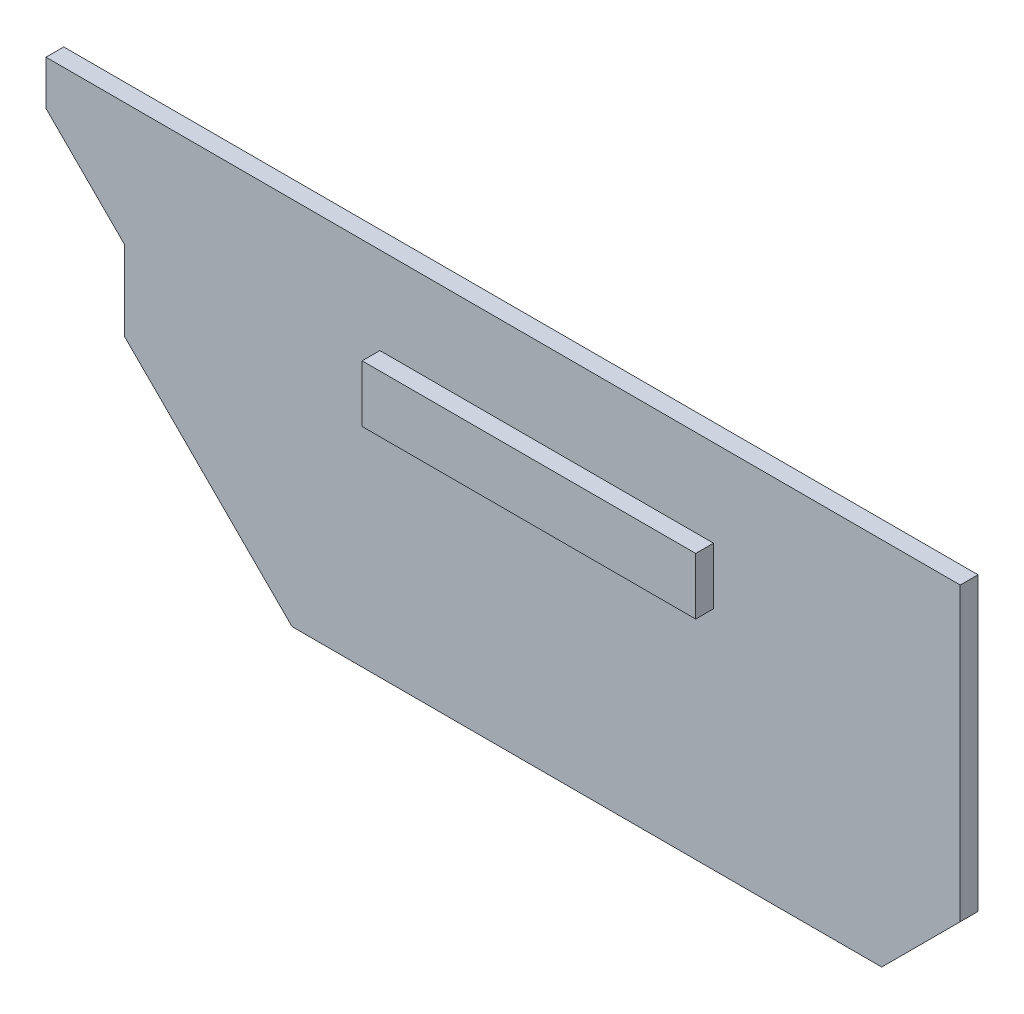
ISO-10303-21;
HEADER;
FILE_DESCRIPTION(('STEP AP214'),'2;1');
FILE_NAME('part.step','',(''),(''),'','','');
FILE_SCHEMA(('AUTOMOTIVE_DESIGN { 1 0 10303 214 1 1 1 1 }'));
ENDSEC;
DATA;
#1=APPLICATION_CONTEXT('core data for automotive mechanical design processes');
#2=APPLICATION_PROTOCOL_DEFINITION('international standard','automotive_design',2000,#1);
#3=PRODUCT_CONTEXT('',#1,'mechanical');
#4=PRODUCT('Part','Part','',(#3));
#5=PRODUCT_RELATED_PRODUCT_CATEGORY('part','',(#4));
#6=PRODUCT_DEFINITION_FORMATION('','',#4);
#7=PRODUCT_DEFINITION_CONTEXT('part definition',#1,'design');
#8=PRODUCT_DEFINITION('design','',#6,#7);
#9=PRODUCT_DEFINITION_SHAPE('','',#8);
#10=(LENGTH_UNIT() NAMED_UNIT(*) SI_UNIT(.MILLI.,.METRE.));
#11=(NAMED_UNIT(*) PLANE_ANGLE_UNIT() SI_UNIT($,.RADIAN.));
#12=(NAMED_UNIT(*) SI_UNIT($,.STERADIAN.) SOLID_ANGLE_UNIT());
#13=UNCERTAINTY_MEASURE_WITH_UNIT(LENGTH_MEASURE(1.E-05),#10,'distance_accuracy_value','');
#14=(GEOMETRIC_REPRESENTATION_CONTEXT(3) GLOBAL_UNCERTAINTY_ASSIGNED_CONTEXT((#13)) GLOBAL_UNIT_ASSIGNED_CONTEXT((#10,
#11,#12)) REPRESENTATION_CONTEXT('',''));
#15=CARTESIAN_POINT('',(0.,0.,0.));
#16=DIRECTION('',(0.,0.,1.));
#17=DIRECTION('',(1.,0.,0.));
#18=AXIS2_PLACEMENT_3D('',#15,#16,#17);
#19=CARTESIAN_POINT('',(0.,0.,2.4));
#20=DIRECTION('',(0.,0.,-1.));
#21=DIRECTION('',(-1.,0.,0.));
#22=AXIS2_PLACEMENT_3D('',#19,#20,#21);
#23=PLANE('',#22);
#24=DIRECTION('',(0.,-1.,0.));
#25=VECTOR('',#24,1.);
#26=CARTESIAN_POINT('',(0.,-6.,2.4));
#27=LINE('',#26,#25);
#28=CARTESIAN_POINT('',(0.,0.,2.4));
#29=VERTEX_POINT('',#28);
#30=CARTESIAN_POINT('',(0.,-6.,2.4));
#31=VERTEX_POINT('',#30);
#32=EDGE_CURVE('E164',#29,#31,#27,.T.);
#33=ORIENTED_EDGE('',*,*,#32,.T.);
#34=DIRECTION('',(0.707106781186549,-0.707106781186546,0.));
#35=VECTOR('',#34,1.);
#36=CARTESIAN_POINT('',(10.6066017177982,-16.6066017177982,2.4));
#37=LINE('',#36,#35);
#38=CARTESIAN_POINT('',(10.6066017177982,-16.6066017177982,2.4));
#39=VERTEX_POINT('',#38);
#40=EDGE_CURVE('E168',#31,#39,#37,.T.);
#41=ORIENTED_EDGE('',*,*,#40,.T.);
#42=DIRECTION('',(0.,-1.,0.));
#43=VECTOR('',#42,1.);
#44=CARTESIAN_POINT('',(10.6066017177982,-27.3725830020305,2.4));
#45=LINE('',#44,#43);
#46=CARTESIAN_POINT('',(10.6066017177982,-27.3725830020305,2.4));
#47=VERTEX_POINT('',#46);
#48=EDGE_CURVE('E172',#39,#47,#45,.T.);
#49=ORIENTED_EDGE('',*,*,#48,.T.);
#50=DIRECTION('',(0.707106781186549,-0.707106781186546,0.));
#51=VECTOR('',#50,1.);
#52=CARTESIAN_POINT('',(33.2340187157678,-50.,2.4));
#53=LINE('',#52,#51);
#54=CARTESIAN_POINT('',(33.2340187157678,-50.,2.4));
#55=VERTEX_POINT('',#54);
#56=EDGE_CURVE('E175',#47,#55,#53,.T.);
#57=ORIENTED_EDGE('',*,*,#56,.T.);
#58=DIRECTION('',(1.,0.,0.));
#59=VECTOR('',#58,1.);
#60=CARTESIAN_POINT('',(112.893398282202,-50.,2.4));
#61=LINE('',#60,#59);
#62=CARTESIAN_POINT('',(112.893398282202,-50.,2.4));
#63=VERTEX_POINT('',#62);
#64=EDGE_CURVE('E178',#55,#63,#61,.T.);
#65=ORIENTED_EDGE('',*,*,#64,.T.);
#66=DIRECTION('',(0.707106781186548,0.707106781186547,0.));
#67=VECTOR('',#66,1.);
#68=CARTESIAN_POINT('',(123.5,-39.3933982822018,2.4));
#69=LINE('',#68,#67);
#70=CARTESIAN_POINT('',(123.5,-39.3933982822018,2.4));
#71=VERTEX_POINT('',#70);
#72=EDGE_CURVE('E181',#63,#71,#69,.T.);
#73=ORIENTED_EDGE('',*,*,#72,.T.);
#74=DIRECTION('',(0.,1.,0.));
#75=VECTOR('',#74,1.);
#76=CARTESIAN_POINT('',(123.5,0.,2.4));
#77=LINE('',#76,#75);
#78=CARTESIAN_POINT('',(123.5,0.,2.4));
#79=VERTEX_POINT('',#78);
#80=EDGE_CURVE('E184',#71,#79,#77,.T.);
#81=ORIENTED_EDGE('',*,*,#80,.T.);
#82=DIRECTION('',(-1.,0.,0.));
#83=VECTOR('',#82,1.);
#84=CARTESIAN_POINT('',(0.,0.,2.4));
#85=LINE('',#84,#83);
#86=EDGE_CURVE('E187',#79,#29,#85,.T.);
#87=ORIENTED_EDGE('',*,*,#86,.T.);
#88=EDGE_LOOP('',(#33,#41,#49,#57,#65,#73,#81,#87));
#89=FACE_BOUND('',#88,.T.);
#90=DIRECTION('',(0.,-1.,0.));
#91=VECTOR('',#90,1.);
#92=CARTESIAN_POINT('',(45.1066017177982,-11.77,2.4));
#93=LINE('',#92,#91);
#94=CARTESIAN_POINT('',(45.1066017177982,-11.77,2.4));
#95=VERTEX_POINT('',#94);
#96=CARTESIAN_POINT('',(45.1066017177982,-19.45,2.4));
#97=VERTEX_POINT('',#96);
#98=EDGE_CURVE('E151',#95,#97,#93,.T.);
#99=ORIENTED_EDGE('',*,*,#98,.F.);
#100=DIRECTION('',(-1.,0.,0.));
#101=VECTOR('',#100,1.);
#102=CARTESIAN_POINT('',(45.1066017177982,-11.77,2.4));
#103=LINE('',#102,#101);
#104=CARTESIAN_POINT('',(90.1666017177982,-11.77,2.4));
#105=VERTEX_POINT('',#104);
#106=EDGE_CURVE('E148',#105,#95,#103,.T.);
#107=ORIENTED_EDGE('',*,*,#106,.F.);
#108=DIRECTION('',(0.,1.,0.));
#109=VECTOR('',#108,1.);
#110=CARTESIAN_POINT('',(90.1666017177982,-11.77,2.4));
#111=LINE('',#110,#109);
#112=CARTESIAN_POINT('',(90.1666017177982,-19.45,2.4));
#113=VERTEX_POINT('',#112);
#114=EDGE_CURVE('E60',#113,#105,#111,.T.);
#115=ORIENTED_EDGE('',*,*,#114,.F.);
#116=DIRECTION('',(1.,0.,0.));
#117=VECTOR('',#116,1.);
#118=CARTESIAN_POINT('',(45.1066017177982,-19.45,2.4));
#119=LINE('',#118,#117);
#120=EDGE_CURVE('E55',#97,#113,#119,.T.);
#121=ORIENTED_EDGE('',*,*,#120,.F.);
#122=EDGE_LOOP('',(#99,#107,#115,#121));
#123=FACE_BOUND('',#122,.T.);
#124=ADVANCED_FACE('F39',(#89,#123),#23,.F.);
#125=CARTESIAN_POINT('',(0.,-6.,2.4));
#126=DIRECTION('',(1.,0.,0.));
#127=DIRECTION('',(0.,0.,-1.));
#128=AXIS2_PLACEMENT_3D('',#125,#126,#127);
#129=PLANE('',#128);
#130=DIRECTION('',(0.,-1.,0.));
#131=VECTOR('',#130,1.);
#132=CARTESIAN_POINT('',(0.,-6.,0.));
#133=LINE('',#132,#131);
#134=CARTESIAN_POINT('',(0.,0.,0.));
#135=VERTEX_POINT('',#134);
#136=CARTESIAN_POINT('',(0.,-6.,0.));
#137=VERTEX_POINT('',#136);
#138=EDGE_CURVE('E153',#135,#137,#133,.T.);
#139=ORIENTED_EDGE('',*,*,#138,.T.);
#140=DIRECTION('',(0.,0.,-1.));
#141=VECTOR('',#140,1.);
#142=CARTESIAN_POINT('',(0.,-6.,2.4));
#143=LINE('',#142,#141);
#144=EDGE_CURVE('E11',#31,#137,#143,.T.);
#145=ORIENTED_EDGE('',*,*,#144,.F.);
#146=ORIENTED_EDGE('',*,*,#32,.F.);
#147=DIRECTION('',(0.,0.,-1.));
#148=VECTOR('',#147,1.);
#149=CARTESIAN_POINT('',(0.,0.,2.4));
#150=LINE('',#149,#148);
#151=EDGE_CURVE('E189',#29,#135,#150,.T.);
#152=ORIENTED_EDGE('',*,*,#151,.T.);
#153=EDGE_LOOP('',(#139,#145,#146,#152));
#154=FACE_BOUND('',#153,.T.);
#155=ADVANCED_FACE('F41',(#154),#129,.F.);
#156=CARTESIAN_POINT('',(10.6066017177982,-16.6066017177982,2.4));
#157=DIRECTION('',(0.707106781186546,0.707106781186549,0.));
#158=DIRECTION('',(-0.707106781186549,0.707106781186546,0.));
#159=AXIS2_PLACEMENT_3D('',#156,#157,#158);
#160=PLANE('',#159);
#161=DIRECTION('',(0.707106781186549,-0.707106781186546,0.));
#162=VECTOR('',#161,1.);
#163=CARTESIAN_POINT('',(10.6066017177982,-16.6066017177982,0.));
#164=LINE('',#163,#162);
#165=CARTESIAN_POINT('',(10.6066017177982,-16.6066017177982,0.));
#166=VERTEX_POINT('',#165);
#167=EDGE_CURVE('E158',#137,#166,#164,.T.);
#168=ORIENTED_EDGE('',*,*,#167,.T.);
#169=DIRECTION('',(0.,0.,-1.));
#170=VECTOR('',#169,1.);
#171=CARTESIAN_POINT('',(10.6066017177982,-16.6066017177982,2.4));
#172=LINE('',#171,#170);
#173=EDGE_CURVE('E48',#39,#166,#172,.T.);
#174=ORIENTED_EDGE('',*,*,#173,.F.);
#175=ORIENTED_EDGE('',*,*,#40,.F.);
#176=ORIENTED_EDGE('',*,*,#144,.T.);
#177=EDGE_LOOP('',(#168,#174,#175,#176));
#178=FACE_BOUND('',#177,.T.);
#179=ADVANCED_FACE('F260',(#178),#160,.F.);
#180=CARTESIAN_POINT('',(10.6066017177982,-27.3725830020305,2.4));
#181=DIRECTION('',(1.,0.,0.));
#182=DIRECTION('',(0.,1.,0.));
#183=AXIS2_PLACEMENT_3D('',#180,#181,#182);
#184=PLANE('',#183);
#185=DIRECTION('',(0.,-1.,0.));
#186=VECTOR('',#185,1.);
#187=CARTESIAN_POINT('',(10.6066017177982,-27.3725830020305,0.));
#188=LINE('',#187,#186);
#189=CARTESIAN_POINT('',(10.6066017177982,-27.3725830020305,0.));
#190=VERTEX_POINT('',#189);
#191=EDGE_CURVE('E193',#166,#190,#188,.T.);
#192=ORIENTED_EDGE('',*,*,#191,.T.);
#193=DIRECTION('',(0.,0.,-1.));
#194=VECTOR('',#193,1.);
#195=CARTESIAN_POINT('',(10.6066017177982,-27.3725830020305,2.4));
#196=LINE('',#195,#194);
#197=EDGE_CURVE('E229',#47,#190,#196,.T.);
#198=ORIENTED_EDGE('',*,*,#197,.F.);
#199=ORIENTED_EDGE('',*,*,#48,.F.);
#200=ORIENTED_EDGE('',*,*,#173,.T.);
#201=EDGE_LOOP('',(#192,#198,#199,#200));
#202=FACE_BOUND('',#201,.T.);
#203=ADVANCED_FACE('F238',(#202),#184,.F.);
#204=CARTESIAN_POINT('',(33.2340187157678,-50.,2.4));
#205=DIRECTION('',(0.707106781186546,0.707106781186549,0.));
#206=DIRECTION('',(-0.707106781186549,0.707106781186546,0.));
#207=AXIS2_PLACEMENT_3D('',#204,#205,#206);
#208=PLANE('',#207);
#209=DIRECTION('',(0.707106781186549,-0.707106781186546,0.));
#210=VECTOR('',#209,1.);
#211=CARTESIAN_POINT('',(33.2340187157678,-50.,0.));
#212=LINE('',#211,#210);
#213=CARTESIAN_POINT('',(33.2340187157678,-50.,0.));
#214=VERTEX_POINT('',#213);
#215=EDGE_CURVE('E196',#190,#214,#212,.T.);
#216=ORIENTED_EDGE('',*,*,#215,.T.);
#217=DIRECTION('',(0.,0.,-1.));
#218=VECTOR('',#217,1.);
#219=CARTESIAN_POINT('',(33.2340187157678,-50.,2.4));
#220=LINE('',#219,#218);
#221=EDGE_CURVE('E225',#55,#214,#220,.T.);
#222=ORIENTED_EDGE('',*,*,#221,.F.);
#223=ORIENTED_EDGE('',*,*,#56,.F.);
#224=ORIENTED_EDGE('',*,*,#197,.T.);
#225=EDGE_LOOP('',(#216,#222,#223,#224));
#226=FACE_BOUND('',#225,.T.);
#227=ADVANCED_FACE('F249',(#226),#208,.F.);
#228=CARTESIAN_POINT('',(112.893398282202,-50.,2.4));
#229=DIRECTION('',(0.,1.,0.));
#230=DIRECTION('',(-1.,0.,0.));
#231=AXIS2_PLACEMENT_3D('',#228,#229,#230);
#232=PLANE('',#231);
#233=DIRECTION('',(1.,0.,0.));
#234=VECTOR('',#233,1.);
#235=CARTESIAN_POINT('',(112.893398282202,-50.,0.));
#236=LINE('',#235,#234);
#237=CARTESIAN_POINT('',(112.893398282202,-50.,0.));
#238=VERTEX_POINT('',#237);
#239=EDGE_CURVE('E199',#214,#238,#236,.T.);
#240=ORIENTED_EDGE('',*,*,#239,.T.);
#241=DIRECTION('',(0.,0.,-1.));
#242=VECTOR('',#241,1.);
#243=CARTESIAN_POINT('',(112.893398282202,-50.,2.4));
#244=LINE('',#243,#242);
#245=EDGE_CURVE('E221',#63,#238,#244,.T.);
#246=ORIENTED_EDGE('',*,*,#245,.F.);
#247=ORIENTED_EDGE('',*,*,#64,.F.);
#248=ORIENTED_EDGE('',*,*,#221,.T.);
#249=EDGE_LOOP('',(#240,#246,#247,#248));
#250=FACE_BOUND('',#249,.T.);
#251=ADVANCED_FACE('F253',(#250),#232,.F.);
#252=CARTESIAN_POINT('',(123.5,-39.3933982822018,2.4));
#253=DIRECTION('',(-0.707106781186547,0.707106781186548,0.));
#254=DIRECTION('',(-0.707106781186548,-0.707106781186547,0.));
#255=AXIS2_PLACEMENT_3D('',#252,#253,#254);
#256=PLANE('',#255);
#257=DIRECTION('',(0.707106781186548,0.707106781186547,0.));
#258=VECTOR('',#257,1.);
#259=CARTESIAN_POINT('',(123.5,-39.3933982822018,0.));
#260=LINE('',#259,#258);
#261=CARTESIAN_POINT('',(123.5,-39.3933982822018,0.));
#262=VERTEX_POINT('',#261);
#263=EDGE_CURVE('E202',#238,#262,#260,.T.);
#264=ORIENTED_EDGE('',*,*,#263,.T.);
#265=DIRECTION('',(0.,0.,-1.));
#266=VECTOR('',#265,1.);
#267=CARTESIAN_POINT('',(123.5,-39.3933982822018,2.4));
#268=LINE('',#267,#266);
#269=EDGE_CURVE('E217',#71,#262,#268,.T.);
#270=ORIENTED_EDGE('',*,*,#269,.F.);
#271=ORIENTED_EDGE('',*,*,#72,.F.);
#272=ORIENTED_EDGE('',*,*,#245,.T.);
#273=EDGE_LOOP('',(#264,#270,#271,#272));
#274=FACE_BOUND('',#273,.T.);
#275=ADVANCED_FACE('F273',(#274),#256,.F.);
#276=CARTESIAN_POINT('',(123.5,0.,2.4));
#277=DIRECTION('',(-1.,0.,0.));
#278=DIRECTION('',(0.,0.,1.));
#279=AXIS2_PLACEMENT_3D('',#276,#277,#278);
#280=PLANE('',#279);
#281=DIRECTION('',(0.,1.,0.));
#282=VECTOR('',#281,1.);
#283=CARTESIAN_POINT('',(123.5,0.,0.));
#284=LINE('',#283,#282);
#285=CARTESIAN_POINT('',(123.5,0.,0.));
#286=VERTEX_POINT('',#285);
#287=EDGE_CURVE('E205',#262,#286,#284,.T.);
#288=ORIENTED_EDGE('',*,*,#287,.T.);
#289=DIRECTION('',(0.,0.,-1.));
#290=VECTOR('',#289,1.);
#291=CARTESIAN_POINT('',(123.5,0.,2.4));
#292=LINE('',#291,#290);
#293=EDGE_CURVE('E213',#79,#286,#292,.T.);
#294=ORIENTED_EDGE('',*,*,#293,.F.);
#295=ORIENTED_EDGE('',*,*,#80,.F.);
#296=ORIENTED_EDGE('',*,*,#269,.T.);
#297=EDGE_LOOP('',(#288,#294,#295,#296));
#298=FACE_BOUND('',#297,.T.);
#299=ADVANCED_FACE('F271',(#298),#280,.F.);
#300=CARTESIAN_POINT('',(0.,0.,2.4));
#301=DIRECTION('',(0.,-1.,0.));
#302=DIRECTION('',(0.,0.,-1.));
#303=AXIS2_PLACEMENT_3D('',#300,#301,#302);
#304=PLANE('',#303);
#305=DIRECTION('',(-1.,0.,0.));
#306=VECTOR('',#305,1.);
#307=CARTESIAN_POINT('',(0.,0.,0.));
#308=LINE('',#307,#306);
#309=EDGE_CURVE('E169',#286,#135,#308,.T.);
#310=ORIENTED_EDGE('',*,*,#309,.T.);
#311=ORIENTED_EDGE('',*,*,#151,.F.);
#312=ORIENTED_EDGE('',*,*,#86,.F.);
#313=ORIENTED_EDGE('',*,*,#293,.T.);
#314=EDGE_LOOP('',(#310,#311,#312,#313));
#315=FACE_BOUND('',#314,.T.);
#316=ADVANCED_FACE('F266',(#315),#304,.F.);
#317=CARTESIAN_POINT('',(0.,0.,0.));
#318=DIRECTION('',(0.,0.,-1.));
#319=DIRECTION('',(-1.,0.,0.));
#320=AXIS2_PLACEMENT_3D('',#317,#318,#319);
#321=PLANE('',#320);
#322=ORIENTED_EDGE('',*,*,#138,.F.);
#323=ORIENTED_EDGE('',*,*,#309,.F.);
#324=ORIENTED_EDGE('',*,*,#287,.F.);
#325=ORIENTED_EDGE('',*,*,#263,.F.);
#326=ORIENTED_EDGE('',*,*,#239,.F.);
#327=ORIENTED_EDGE('',*,*,#215,.F.);
#328=ORIENTED_EDGE('',*,*,#191,.F.);
#329=ORIENTED_EDGE('',*,*,#167,.F.);
#330=EDGE_LOOP('',(#322,#323,#324,#325,#326,#327,#328,#329));
#331=FACE_BOUND('',#330,.T.);
#332=ADVANCED_FACE('F244',(#331),#321,.T.);
#333=CARTESIAN_POINT('',(45.1066017177982,-11.77,4.8));
#334=DIRECTION('',(1.,0.,0.));
#335=DIRECTION('',(0.,1.,0.));
#336=AXIS2_PLACEMENT_3D('',#333,#334,#335);
#337=PLANE('',#336);
#338=ORIENTED_EDGE('',*,*,#98,.T.);
#339=DIRECTION('',(0.,0.,-1.));
#340=VECTOR('',#339,1.);
#341=CARTESIAN_POINT('',(45.1066017177982,-19.45,4.8));
#342=LINE('',#341,#340);
#343=CARTESIAN_POINT('',(45.1066017177982,-19.45,4.8));
#344=VERTEX_POINT('',#343);
#345=EDGE_CURVE('E130',#344,#97,#342,.T.);
#346=ORIENTED_EDGE('',*,*,#345,.F.);
#347=DIRECTION('',(0.,-1.,0.));
#348=VECTOR('',#347,1.);
#349=CARTESIAN_POINT('',(45.1066017177982,-11.77,4.8));
#350=LINE('',#349,#348);
#351=CARTESIAN_POINT('',(45.1066017177982,-11.77,4.8));
#352=VERTEX_POINT('',#351);
#353=EDGE_CURVE('E138',#352,#344,#350,.T.);
#354=ORIENTED_EDGE('',*,*,#353,.F.);
#355=DIRECTION('',(0.,0.,-1.));
#356=VECTOR('',#355,1.);
#357=CARTESIAN_POINT('',(45.1066017177982,-11.77,4.8));
#358=LINE('',#357,#356);
#359=EDGE_CURVE('E398',#352,#95,#358,.T.);
#360=ORIENTED_EDGE('',*,*,#359,.T.);
#361=EDGE_LOOP('',(#338,#346,#354,#360));
#362=FACE_BOUND('',#361,.T.);
#363=ADVANCED_FACE('F150',(#362),#337,.F.);
#364=CARTESIAN_POINT('',(45.1066017177982,-19.45,4.8));
#365=DIRECTION('',(0.,1.,0.));
#366=DIRECTION('',(0.,0.,1.));
#367=AXIS2_PLACEMENT_3D('',#364,#365,#366);
#368=PLANE('',#367);
#369=ORIENTED_EDGE('',*,*,#120,.T.);
#370=DIRECTION('',(0.,0.,-1.));
#371=VECTOR('',#370,1.);
#372=CARTESIAN_POINT('',(90.1666017177982,-19.45,4.8));
#373=LINE('',#372,#371);
#374=CARTESIAN_POINT('',(90.1666017177982,-19.45,4.8));
#375=VERTEX_POINT('',#374);
#376=EDGE_CURVE('E133',#375,#113,#373,.T.);
#377=ORIENTED_EDGE('',*,*,#376,.F.);
#378=DIRECTION('',(1.,0.,0.));
#379=VECTOR('',#378,1.);
#380=CARTESIAN_POINT('',(45.1066017177982,-19.45,4.8));
#381=LINE('',#380,#379);
#382=EDGE_CURVE('E126',#344,#375,#381,.T.);
#383=ORIENTED_EDGE('',*,*,#382,.F.);
#384=ORIENTED_EDGE('',*,*,#345,.T.);
#385=EDGE_LOOP('',(#369,#377,#383,#384));
#386=FACE_BOUND('',#385,.T.);
#387=ADVANCED_FACE('F128',(#386),#368,.F.);
#388=CARTESIAN_POINT('',(90.1666017177982,-11.77,4.8));
#389=DIRECTION('',(-1.,0.,0.));
#390=DIRECTION('',(0.,-1.,0.));
#391=AXIS2_PLACEMENT_3D('',#388,#389,#390);
#392=PLANE('',#391);
#393=ORIENTED_EDGE('',*,*,#114,.T.);
#394=DIRECTION('',(0.,0.,-1.));
#395=VECTOR('',#394,1.);
#396=CARTESIAN_POINT('',(90.1666017177982,-11.77,4.8));
#397=LINE('',#396,#395);
#398=CARTESIAN_POINT('',(90.1666017177982,-11.77,4.8));
#399=VERTEX_POINT('',#398);
#400=EDGE_CURVE('E160',#399,#105,#397,.T.);
#401=ORIENTED_EDGE('',*,*,#400,.F.);
#402=DIRECTION('',(0.,1.,0.));
#403=VECTOR('',#402,1.);
#404=CARTESIAN_POINT('',(90.1666017177982,-11.77,4.8));
#405=LINE('',#404,#403);
#406=EDGE_CURVE('E137',#375,#399,#405,.T.);
#407=ORIENTED_EDGE('',*,*,#406,.F.);
#408=ORIENTED_EDGE('',*,*,#376,.T.);
#409=EDGE_LOOP('',(#393,#401,#407,#408));
#410=FACE_BOUND('',#409,.T.);
#411=ADVANCED_FACE('F312',(#410),#392,.F.);
#412=CARTESIAN_POINT('',(45.1066017177982,-11.77,4.8));
#413=DIRECTION('',(0.,-1.,0.));
#414=DIRECTION('',(0.,0.,-1.));
#415=AXIS2_PLACEMENT_3D('',#412,#413,#414);
#416=PLANE('',#415);
#417=ORIENTED_EDGE('',*,*,#106,.T.);
#418=ORIENTED_EDGE('',*,*,#359,.F.);
#419=DIRECTION('',(-1.,0.,0.));
#420=VECTOR('',#419,1.);
#421=CARTESIAN_POINT('',(45.1066017177982,-11.77,4.8));
#422=LINE('',#421,#420);
#423=EDGE_CURVE('E143',#399,#352,#422,.T.);
#424=ORIENTED_EDGE('',*,*,#423,.F.);
#425=ORIENTED_EDGE('',*,*,#400,.T.);
#426=EDGE_LOOP('',(#417,#418,#424,#425));
#427=FACE_BOUND('',#426,.T.);
#428=ADVANCED_FACE('F318',(#427),#416,.F.);
#429=CARTESIAN_POINT('',(0.,0.,4.8));
#430=DIRECTION('',(0.,0.,1.));
#431=DIRECTION('',(1.,0.,0.));
#432=AXIS2_PLACEMENT_3D('',#429,#430,#431);
#433=PLANE('',#432);
#434=ORIENTED_EDGE('',*,*,#353,.T.);
#435=ORIENTED_EDGE('',*,*,#382,.T.);
#436=ORIENTED_EDGE('',*,*,#406,.T.);
#437=ORIENTED_EDGE('',*,*,#423,.T.);
#438=EDGE_LOOP('',(#434,#435,#436,#437));
#439=FACE_BOUND('',#438,.T.);
#440=ADVANCED_FACE('F141',(#439),#433,.T.);
#441=CLOSED_SHELL('',(#124,#155,#179,#203,#227,#251,#275,#299,#316,#332,#363,#387,#411,#428,#440));
#442=MANIFOLD_SOLID_BREP('B2',#441);
#443=ADVANCED_BREP_SHAPE_REPRESENTATION('',(#18,#442),#14);
#444=SHAPE_DEFINITION_REPRESENTATION(#9,#443);
ENDSEC;
END-ISO-10303-21;
